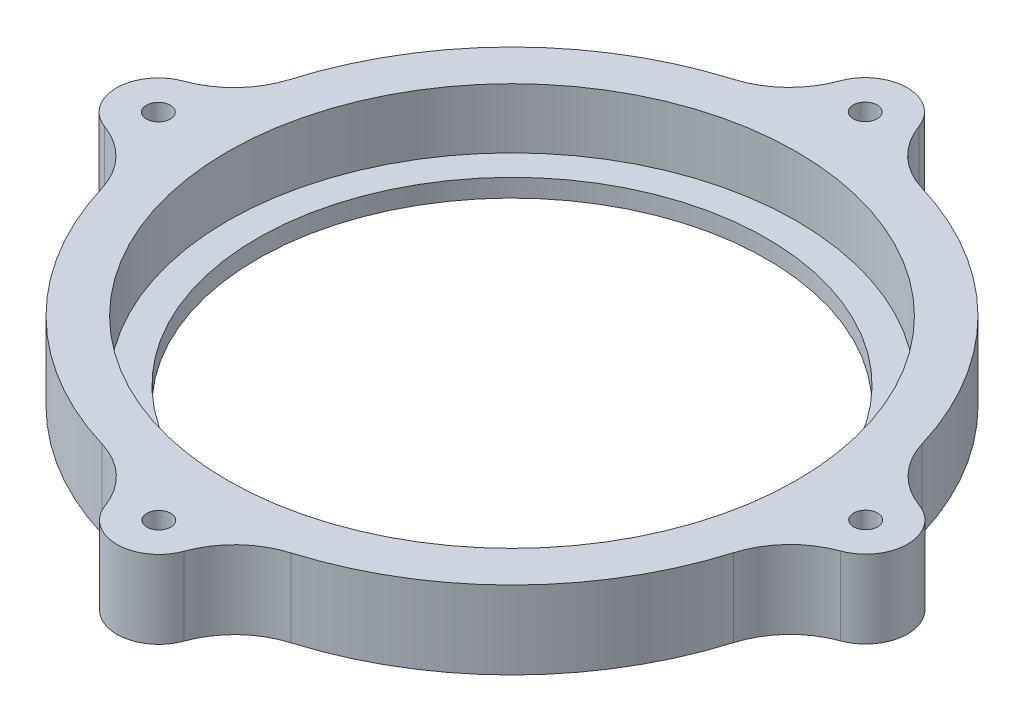
ISO-10303-21;
HEADER;
FILE_DESCRIPTION(('STEP AP214'),'2;1');
FILE_NAME('part.step','',(''),(''),'','','');
FILE_SCHEMA(('AUTOMOTIVE_DESIGN { 1 0 10303 214 1 1 1 1 }'));
ENDSEC;
DATA;
#1=APPLICATION_CONTEXT('core data for automotive mechanical design processes');
#2=APPLICATION_PROTOCOL_DEFINITION('international standard','automotive_design',2000,#1);
#3=PRODUCT_CONTEXT('',#1,'mechanical');
#4=PRODUCT('Part','Part','',(#3));
#5=PRODUCT_RELATED_PRODUCT_CATEGORY('part','',(#4));
#6=PRODUCT_DEFINITION_FORMATION('','',#4);
#7=PRODUCT_DEFINITION_CONTEXT('part definition',#1,'design');
#8=PRODUCT_DEFINITION('design','',#6,#7);
#9=PRODUCT_DEFINITION_SHAPE('','',#8);
#10=(LENGTH_UNIT() NAMED_UNIT(*) SI_UNIT(.MILLI.,.METRE.));
#11=(NAMED_UNIT(*) PLANE_ANGLE_UNIT() SI_UNIT($,.RADIAN.));
#12=(NAMED_UNIT(*) SI_UNIT($,.STERADIAN.) SOLID_ANGLE_UNIT());
#13=UNCERTAINTY_MEASURE_WITH_UNIT(LENGTH_MEASURE(1.E-05),#10,'distance_accuracy_value','');
#14=(GEOMETRIC_REPRESENTATION_CONTEXT(3) GLOBAL_UNCERTAINTY_ASSIGNED_CONTEXT((#13)) GLOBAL_UNIT_ASSIGNED_CONTEXT((#10,
#11,#12)) REPRESENTATION_CONTEXT('',''));
#15=CARTESIAN_POINT('',(0.,0.,0.));
#16=DIRECTION('',(0.,0.,1.));
#17=DIRECTION('',(1.,0.,0.));
#18=AXIS2_PLACEMENT_3D('',#15,#16,#17);
#19=CARTESIAN_POINT('',(58.9885902404785,-13.,-0.0388662219047546));
#20=DIRECTION('',(0.,1.,0.));
#21=DIRECTION('',(0.,0.,1.));
#22=AXIS2_PLACEMENT_3D('',#19,#20,#21);
#23=CYLINDRICAL_SURFACE('',#22,7.00000000000002);
#24=CARTESIAN_POINT('',(58.9885902404785,0.,-0.0388662219047546));
#25=DIRECTION('',(0.,1.,0.));
#26=DIRECTION('',(0.,0.,1.));
#27=AXIS2_PLACEMENT_3D('',#24,#25,#26);
#28=CIRCLE('',#27,7.00000000000002);
#29=CARTESIAN_POINT('',(61.3672422079059,0.,6.54459903720112));
#30=VERTEX_POINT('',#29);
#31=CARTESIAN_POINT('',(61.3585647595326,0.,-6.62546024150506));
#32=VERTEX_POINT('',#31);
#33=EDGE_CURVE('E220',#30,#32,#28,.T.);
#34=ORIENTED_EDGE('',*,*,#33,.F.);
#35=DIRECTION('',(0.,1.,0.));
#36=VECTOR('',#35,1.);
#37=CARTESIAN_POINT('',(61.3672422079059,-13.,6.54459903720112));
#38=LINE('',#37,#36);
#39=CARTESIAN_POINT('',(61.3672422079059,-13.,6.54459903720112));
#40=VERTEX_POINT('',#39);
#41=EDGE_CURVE('E11',#40,#30,#38,.T.);
#42=ORIENTED_EDGE('',*,*,#41,.F.);
#43=CARTESIAN_POINT('',(58.9885902404785,-13.,-0.0388662219047546));
#44=DIRECTION('',(0.,1.,0.));
#45=DIRECTION('',(0.,0.,1.));
#46=AXIS2_PLACEMENT_3D('',#43,#44,#45);
#47=CIRCLE('',#46,7.00000000000002);
#48=CARTESIAN_POINT('',(61.3585647595326,-13.,-6.62546024150506));
#49=VERTEX_POINT('',#48);
#50=EDGE_CURVE('E323',#40,#49,#47,.T.);
#51=ORIENTED_EDGE('',*,*,#50,.T.);
#52=DIRECTION('',(0.,1.,0.));
#53=VECTOR('',#52,1.);
#54=CARTESIAN_POINT('',(61.3585647595326,-13.,-6.62546024150506));
#55=LINE('',#54,#53);
#56=EDGE_CURVE('E129',#49,#32,#55,.T.);
#57=ORIENTED_EDGE('',*,*,#56,.T.);
#58=EDGE_LOOP('',(#34,#42,#51,#57));
#59=FACE_BOUND('',#58,.T.);
#60=ADVANCED_FACE('F47',(#59),#23,.T.);
#61=CARTESIAN_POINT('',(66.1245461427607,-13.,19.7115295554128));
#62=DIRECTION('',(0.,1.,0.));
#63=DIRECTION('',(0.,0.,1.));
#64=AXIS2_PLACEMENT_3D('',#61,#62,#63);
#65=CYLINDRICAL_SURFACE('',#64,14.);
#66=CARTESIAN_POINT('',(66.1245461427607,0.,19.7115295554128));
#67=DIRECTION('',(0.,1.,0.));
#68=DIRECTION('',(0.,0.,1.));
#69=AXIS2_PLACEMENT_3D('',#66,#67,#68);
#70=CIRCLE('',#69,14.);
#71=CARTESIAN_POINT('',(52.7079715630701,0.,15.7120887760537));
#72=VERTEX_POINT('',#71);
#73=EDGE_CURVE('E270',#30,#72,#70,.T.);
#74=ORIENTED_EDGE('',*,*,#73,.T.);
#75=DIRECTION('',(0.,1.,0.));
#76=VECTOR('',#75,1.);
#77=CARTESIAN_POINT('',(52.7079715630701,-13.,15.7120887760537));
#78=LINE('',#77,#76);
#79=CARTESIAN_POINT('',(52.7079715630701,-13.,15.7120887760537));
#80=VERTEX_POINT('',#79);
#81=EDGE_CURVE('E58',#80,#72,#78,.T.);
#82=ORIENTED_EDGE('',*,*,#81,.F.);
#83=CARTESIAN_POINT('',(66.1245461427607,-13.,19.7115295554128));
#84=DIRECTION('',(0.,1.,0.));
#85=DIRECTION('',(0.,0.,1.));
#86=AXIS2_PLACEMENT_3D('',#83,#84,#85);
#87=CIRCLE('',#86,14.);
#88=EDGE_CURVE('E188',#40,#80,#87,.T.);
#89=ORIENTED_EDGE('',*,*,#88,.F.);
#90=ORIENTED_EDGE('',*,*,#41,.T.);
#91=EDGE_LOOP('',(#74,#82,#89,#90));
#92=FACE_BOUND('',#91,.T.);
#93=ADVANCED_FACE('F329',(#92),#65,.F.);
#94=CARTESIAN_POINT('',(0.,-13.,0.));
#95=DIRECTION('',(0.,1.,0.));
#96=DIRECTION('',(0.,0.,1.));
#97=AXIS2_PLACEMENT_3D('',#94,#95,#96);
#98=CYLINDRICAL_SURFACE('',#97,55.);
#99=CARTESIAN_POINT('',(0.,0.,0.));
#100=DIRECTION('',(0.,1.,0.));
#101=DIRECTION('',(0.,0.,1.));
#102=AXIS2_PLACEMENT_3D('',#99,#100,#101);
#103=CIRCLE('',#102,55.);
#104=CARTESIAN_POINT('',(15.7815312382434,0.,52.6872211430471));
#105=VERTEX_POINT('',#104);
#106=EDGE_CURVE('E172',#105,#72,#103,.T.);
#107=ORIENTED_EDGE('',*,*,#106,.F.);
#108=DIRECTION('',(0.,1.,0.));
#109=VECTOR('',#108,1.);
#110=CARTESIAN_POINT('',(15.7815312382434,-13.,52.6872211430471));
#111=LINE('',#110,#109);
#112=CARTESIAN_POINT('',(15.7815312382434,-13.,52.6872211430471));
#113=VERTEX_POINT('',#112);
#114=EDGE_CURVE('E167',#113,#105,#111,.T.);
#115=ORIENTED_EDGE('',*,*,#114,.F.);
#116=CARTESIAN_POINT('',(0.,-13.,0.));
#117=DIRECTION('',(0.,1.,0.));
#118=DIRECTION('',(0.,0.,1.));
#119=AXIS2_PLACEMENT_3D('',#116,#117,#118);
#120=CIRCLE('',#119,55.);
#121=EDGE_CURVE('E170',#113,#80,#120,.T.);
#122=ORIENTED_EDGE('',*,*,#121,.T.);
#123=ORIENTED_EDGE('',*,*,#81,.T.);
#124=EDGE_LOOP('',(#107,#115,#122,#123));
#125=FACE_BOUND('',#124,.T.);
#126=ADVANCED_FACE('F169',(#125),#98,.T.);
#127=CARTESIAN_POINT('',(19.7986482807054,-13.,66.0985137976409));
#128=DIRECTION('',(0.,1.,0.));
#129=DIRECTION('',(0.,0.,1.));
#130=AXIS2_PLACEMENT_3D('',#127,#128,#129);
#131=CYLINDRICAL_SURFACE('',#130,14.);
#132=CARTESIAN_POINT('',(19.7986482807054,0.,66.0985137976409));
#133=DIRECTION('',(0.,1.,0.));
#134=DIRECTION('',(0.,0.,1.));
#135=AXIS2_PLACEMENT_3D('',#132,#133,#134);
#136=CIRCLE('',#135,14.);
#137=CARTESIAN_POINT('',(6.62546024150485,0.,61.3585647595326));
#138=VERTEX_POINT('',#137);
#139=EDGE_CURVE('E267',#138,#105,#136,.F.);
#140=ORIENTED_EDGE('',*,*,#139,.F.);
#141=DIRECTION('',(0.,1.,0.));
#142=VECTOR('',#141,1.);
#143=CARTESIAN_POINT('',(6.62546024150485,-13.,61.3585647595326));
#144=LINE('',#143,#142);
#145=CARTESIAN_POINT('',(6.62546024150485,-13.,61.3585647595326));
#146=VERTEX_POINT('',#145);
#147=EDGE_CURVE('E178',#146,#138,#144,.T.);
#148=ORIENTED_EDGE('',*,*,#147,.F.);
#149=CARTESIAN_POINT('',(19.7986482807054,-13.,66.0985137976409));
#150=DIRECTION('',(0.,1.,0.));
#151=DIRECTION('',(0.,0.,1.));
#152=AXIS2_PLACEMENT_3D('',#149,#150,#151);
#153=CIRCLE('',#152,14.);
#154=EDGE_CURVE('E186',#146,#113,#153,.F.);
#155=ORIENTED_EDGE('',*,*,#154,.T.);
#156=ORIENTED_EDGE('',*,*,#114,.T.);
#157=EDGE_LOOP('',(#140,#148,#155,#156));
#158=FACE_BOUND('',#157,.T.);
#159=ADVANCED_FACE('F193',(#158),#131,.F.);
#160=CARTESIAN_POINT('',(0.0388662219045486,-13.,58.9885902404785));
#161=DIRECTION('',(0.,1.,0.));
#162=DIRECTION('',(0.,0.,1.));
#163=AXIS2_PLACEMENT_3D('',#160,#161,#162);
#164=CYLINDRICAL_SURFACE('',#163,7.00000000000002);
#165=CARTESIAN_POINT('',(0.0388662219045486,0.,58.9885902404785));
#166=DIRECTION('',(0.,1.,0.));
#167=DIRECTION('',(0.,0.,1.));
#168=AXIS2_PLACEMENT_3D('',#165,#166,#167);
#169=CIRCLE('',#168,7.00000000000002);
#170=CARTESIAN_POINT('',(-6.54459903720134,0.,61.3672422079059));
#171=VERTEX_POINT('',#170);
#172=EDGE_CURVE('E263',#171,#138,#169,.T.);
#173=ORIENTED_EDGE('',*,*,#172,.F.);
#174=DIRECTION('',(0.,1.,0.));
#175=VECTOR('',#174,1.);
#176=CARTESIAN_POINT('',(-6.54459903720134,-13.,61.3672422079059));
#177=LINE('',#176,#175);
#178=CARTESIAN_POINT('',(-6.54459903720134,-13.,61.3672422079059));
#179=VERTEX_POINT('',#178);
#180=EDGE_CURVE('E290',#179,#171,#177,.T.);
#181=ORIENTED_EDGE('',*,*,#180,.F.);
#182=CARTESIAN_POINT('',(0.0388662219045486,-13.,58.9885902404785));
#183=DIRECTION('',(0.,1.,0.));
#184=DIRECTION('',(0.,0.,1.));
#185=AXIS2_PLACEMENT_3D('',#182,#183,#184);
#186=CIRCLE('',#185,7.00000000000002);
#187=EDGE_CURVE('E195',#179,#146,#186,.T.);
#188=ORIENTED_EDGE('',*,*,#187,.T.);
#189=ORIENTED_EDGE('',*,*,#147,.T.);
#190=EDGE_LOOP('',(#173,#181,#188,#189));
#191=FACE_BOUND('',#190,.T.);
#192=ADVANCED_FACE('F411',(#191),#164,.T.);
#193=CARTESIAN_POINT('',(-19.7115295554131,-13.,66.1245461427606));
#194=DIRECTION('',(0.,1.,0.));
#195=DIRECTION('',(0.,0.,1.));
#196=AXIS2_PLACEMENT_3D('',#193,#194,#195);
#197=CYLINDRICAL_SURFACE('',#196,14.);
#198=CARTESIAN_POINT('',(-19.7115295554131,0.,66.1245461427606));
#199=DIRECTION('',(0.,1.,0.));
#200=DIRECTION('',(0.,0.,1.));
#201=AXIS2_PLACEMENT_3D('',#198,#199,#200);
#202=CIRCLE('',#201,14.);
#203=CARTESIAN_POINT('',(-15.7120887760539,0.,52.7079715630701));
#204=VERTEX_POINT('',#203);
#205=EDGE_CURVE('E259',#171,#204,#202,.T.);
#206=ORIENTED_EDGE('',*,*,#205,.T.);
#207=DIRECTION('',(0.,1.,0.));
#208=VECTOR('',#207,1.);
#209=CARTESIAN_POINT('',(-15.7120887760539,-13.,52.7079715630701));
#210=LINE('',#209,#208);
#211=CARTESIAN_POINT('',(-15.7120887760539,-13.,52.7079715630701));
#212=VERTEX_POINT('',#211);
#213=EDGE_CURVE('E293',#212,#204,#210,.T.);
#214=ORIENTED_EDGE('',*,*,#213,.F.);
#215=CARTESIAN_POINT('',(-19.7115295554131,-13.,66.1245461427606));
#216=DIRECTION('',(0.,1.,0.));
#217=DIRECTION('',(0.,0.,1.));
#218=AXIS2_PLACEMENT_3D('',#215,#216,#217);
#219=CIRCLE('',#218,14.);
#220=EDGE_CURVE('E198',#179,#212,#219,.T.);
#221=ORIENTED_EDGE('',*,*,#220,.F.);
#222=ORIENTED_EDGE('',*,*,#180,.T.);
#223=EDGE_LOOP('',(#206,#214,#221,#222));
#224=FACE_BOUND('',#223,.T.);
#225=ADVANCED_FACE('F409',(#224),#197,.F.);
#226=CARTESIAN_POINT('',(-52.6872211430471,0.,15.7815312382433));
#227=VERTEX_POINT('',#226);
#228=EDGE_CURVE('E258',#227,#204,#103,.T.);
#229=ORIENTED_EDGE('',*,*,#228,.F.);
#230=DIRECTION('',(0.,1.,0.));
#231=VECTOR('',#230,1.);
#232=CARTESIAN_POINT('',(-52.6872211430471,-13.,15.7815312382433));
#233=LINE('',#232,#231);
#234=CARTESIAN_POINT('',(-52.6872211430471,-13.,15.7815312382433));
#235=VERTEX_POINT('',#234);
#236=EDGE_CURVE('E296',#235,#227,#233,.T.);
#237=ORIENTED_EDGE('',*,*,#236,.F.);
#238=EDGE_CURVE('E191',#235,#212,#120,.T.);
#239=ORIENTED_EDGE('',*,*,#238,.T.);
#240=ORIENTED_EDGE('',*,*,#213,.T.);
#241=EDGE_LOOP('',(#229,#237,#239,#240));
#242=FACE_BOUND('',#241,.T.);
#243=ADVANCED_FACE('F407',(#242),#98,.T.);
#244=CARTESIAN_POINT('',(-66.0985137976409,-13.,19.7986482807052));
#245=DIRECTION('',(0.,1.,0.));
#246=DIRECTION('',(0.,0.,1.));
#247=AXIS2_PLACEMENT_3D('',#244,#245,#246);
#248=CYLINDRICAL_SURFACE('',#247,14.);
#249=CARTESIAN_POINT('',(-66.0985137976409,0.,19.7986482807052));
#250=DIRECTION('',(0.,1.,0.));
#251=DIRECTION('',(0.,0.,1.));
#252=AXIS2_PLACEMENT_3D('',#249,#250,#251);
#253=CIRCLE('',#252,14.);
#254=CARTESIAN_POINT('',(-61.3585647595327,0.,6.62546024150463));
#255=VERTEX_POINT('',#254);
#256=EDGE_CURVE('E254',#255,#227,#253,.F.);
#257=ORIENTED_EDGE('',*,*,#256,.F.);
#258=DIRECTION('',(0.,1.,0.));
#259=VECTOR('',#258,1.);
#260=CARTESIAN_POINT('',(-61.3585647595327,-13.,6.62546024150463));
#261=LINE('',#260,#259);
#262=CARTESIAN_POINT('',(-61.3585647595327,-13.,6.62546024150463));
#263=VERTEX_POINT('',#262);
#264=EDGE_CURVE('E299',#263,#255,#261,.T.);
#265=ORIENTED_EDGE('',*,*,#264,.F.);
#266=CARTESIAN_POINT('',(-66.0985137976409,-13.,19.7986482807052));
#267=DIRECTION('',(0.,1.,0.));
#268=DIRECTION('',(0.,0.,1.));
#269=AXIS2_PLACEMENT_3D('',#266,#267,#268);
#270=CIRCLE('',#269,14.);
#271=EDGE_CURVE('E362',#263,#235,#270,.F.);
#272=ORIENTED_EDGE('',*,*,#271,.T.);
#273=ORIENTED_EDGE('',*,*,#236,.T.);
#274=EDGE_LOOP('',(#257,#265,#272,#273));
#275=FACE_BOUND('',#274,.T.);
#276=ADVANCED_FACE('F442',(#275),#248,.F.);
#277=CARTESIAN_POINT('',(-58.9885902404785,-13.,0.0388662219043427));
#278=DIRECTION('',(0.,1.,0.));
#279=DIRECTION('',(0.,0.,1.));
#280=AXIS2_PLACEMENT_3D('',#277,#278,#279);
#281=CYLINDRICAL_SURFACE('',#280,7.00000000000002);
#282=CARTESIAN_POINT('',(-58.9885902404785,0.,0.0388662219043427));
#283=DIRECTION('',(0.,1.,0.));
#284=DIRECTION('',(0.,0.,1.));
#285=AXIS2_PLACEMENT_3D('',#282,#283,#284);
#286=CIRCLE('',#285,7.00000000000002);
#287=CARTESIAN_POINT('',(-61.3672422079059,0.,-6.54459903720155));
#288=VERTEX_POINT('',#287);
#289=EDGE_CURVE('E250',#288,#255,#286,.T.);
#290=ORIENTED_EDGE('',*,*,#289,.F.);
#291=DIRECTION('',(0.,1.,0.));
#292=VECTOR('',#291,1.);
#293=CARTESIAN_POINT('',(-61.3672422079059,-13.,-6.54459903720155));
#294=LINE('',#293,#292);
#295=CARTESIAN_POINT('',(-61.3672422079059,-13.,-6.54459903720155));
#296=VERTEX_POINT('',#295);
#297=EDGE_CURVE('E302',#296,#288,#294,.T.);
#298=ORIENTED_EDGE('',*,*,#297,.F.);
#299=CARTESIAN_POINT('',(-58.9885902404785,-13.,0.0388662219043427));
#300=DIRECTION('',(0.,1.,0.));
#301=DIRECTION('',(0.,0.,1.));
#302=AXIS2_PLACEMENT_3D('',#299,#300,#301);
#303=CIRCLE('',#302,7.00000000000002);
#304=EDGE_CURVE('E358',#296,#263,#303,.T.);
#305=ORIENTED_EDGE('',*,*,#304,.T.);
#306=ORIENTED_EDGE('',*,*,#264,.T.);
#307=EDGE_LOOP('',(#290,#298,#305,#306));
#308=FACE_BOUND('',#307,.T.);
#309=ADVANCED_FACE('F438',(#308),#281,.T.);
#310=CARTESIAN_POINT('',(-66.1245461427606,-13.,-19.7115295554133));
#311=DIRECTION('',(0.,1.,0.));
#312=DIRECTION('',(0.,0.,1.));
#313=AXIS2_PLACEMENT_3D('',#310,#311,#312);
#314=CYLINDRICAL_SURFACE('',#313,14.);
#315=CARTESIAN_POINT('',(-66.1245461427606,0.,-19.7115295554133));
#316=DIRECTION('',(0.,1.,0.));
#317=DIRECTION('',(0.,0.,1.));
#318=AXIS2_PLACEMENT_3D('',#315,#316,#317);
#319=CIRCLE('',#318,14.);
#320=CARTESIAN_POINT('',(-52.70797156307,0.,-15.7120887760541));
#321=VERTEX_POINT('',#320);
#322=EDGE_CURVE('E246',#288,#321,#319,.T.);
#323=ORIENTED_EDGE('',*,*,#322,.T.);
#324=DIRECTION('',(0.,1.,0.));
#325=VECTOR('',#324,1.);
#326=CARTESIAN_POINT('',(-52.70797156307,-13.,-15.7120887760541));
#327=LINE('',#326,#325);
#328=CARTESIAN_POINT('',(-52.70797156307,-13.,-15.7120887760541));
#329=VERTEX_POINT('',#328);
#330=EDGE_CURVE('E305',#329,#321,#327,.T.);
#331=ORIENTED_EDGE('',*,*,#330,.F.);
#332=CARTESIAN_POINT('',(-66.1245461427606,-13.,-19.7115295554133));
#333=DIRECTION('',(0.,1.,0.));
#334=DIRECTION('',(0.,0.,1.));
#335=AXIS2_PLACEMENT_3D('',#332,#333,#334);
#336=CIRCLE('',#335,14.);
#337=EDGE_CURVE('E355',#296,#329,#336,.T.);
#338=ORIENTED_EDGE('',*,*,#337,.F.);
#339=ORIENTED_EDGE('',*,*,#297,.T.);
#340=EDGE_LOOP('',(#323,#331,#338,#339));
#341=FACE_BOUND('',#340,.T.);
#342=ADVANCED_FACE('F435',(#341),#314,.F.);
#343=CARTESIAN_POINT('',(-15.7815312382431,0.,-52.6872211430472));
#344=VERTEX_POINT('',#343);
#345=EDGE_CURVE('E234',#344,#321,#103,.T.);
#346=ORIENTED_EDGE('',*,*,#345,.F.);
#347=DIRECTION('',(0.,1.,0.));
#348=VECTOR('',#347,1.);
#349=CARTESIAN_POINT('',(-15.7815312382431,-13.,-52.6872211430472));
#350=LINE('',#349,#348);
#351=CARTESIAN_POINT('',(-15.7815312382431,-13.,-52.6872211430472));
#352=VERTEX_POINT('',#351);
#353=EDGE_CURVE('E308',#352,#344,#350,.T.);
#354=ORIENTED_EDGE('',*,*,#353,.F.);
#355=EDGE_CURVE('E344',#352,#329,#120,.T.);
#356=ORIENTED_EDGE('',*,*,#355,.T.);
#357=ORIENTED_EDGE('',*,*,#330,.T.);
#358=EDGE_LOOP('',(#346,#354,#356,#357));
#359=FACE_BOUND('',#358,.T.);
#360=ADVANCED_FACE('F377',(#359),#98,.T.);
#361=CARTESIAN_POINT('',(-19.798648280705,-13.,-66.098513797641));
#362=DIRECTION('',(0.,1.,0.));
#363=DIRECTION('',(0.,0.,1.));
#364=AXIS2_PLACEMENT_3D('',#361,#362,#363);
#365=CYLINDRICAL_SURFACE('',#364,14.);
#366=CARTESIAN_POINT('',(-19.798648280705,0.,-66.098513797641));
#367=DIRECTION('',(0.,1.,0.));
#368=DIRECTION('',(0.,0.,1.));
#369=AXIS2_PLACEMENT_3D('',#366,#367,#368);
#370=CIRCLE('',#369,14.);
#371=CARTESIAN_POINT('',(-6.62546024150442,0.,-61.3585647595327));
#372=VERTEX_POINT('',#371);
#373=EDGE_CURVE('E242',#372,#344,#370,.F.);
#374=ORIENTED_EDGE('',*,*,#373,.F.);
#375=DIRECTION('',(0.,1.,0.));
#376=VECTOR('',#375,1.);
#377=CARTESIAN_POINT('',(-6.62546024150442,-13.,-61.3585647595327));
#378=LINE('',#377,#376);
#379=CARTESIAN_POINT('',(-6.62546024150442,-13.,-61.3585647595327));
#380=VERTEX_POINT('',#379);
#381=EDGE_CURVE('E311',#380,#372,#378,.T.);
#382=ORIENTED_EDGE('',*,*,#381,.F.);
#383=CARTESIAN_POINT('',(-19.798648280705,-13.,-66.098513797641));
#384=DIRECTION('',(0.,1.,0.));
#385=DIRECTION('',(0.,0.,1.));
#386=AXIS2_PLACEMENT_3D('',#383,#384,#385);
#387=CIRCLE('',#386,14.);
#388=EDGE_CURVE('E351',#380,#352,#387,.F.);
#389=ORIENTED_EDGE('',*,*,#388,.T.);
#390=ORIENTED_EDGE('',*,*,#353,.T.);
#391=EDGE_LOOP('',(#374,#382,#389,#390));
#392=FACE_BOUND('',#391,.T.);
#393=ADVANCED_FACE('F385',(#392),#365,.F.);
#394=CARTESIAN_POINT('',(-0.0388662219041367,-13.,-58.9885902404785));
#395=DIRECTION('',(0.,1.,0.));
#396=DIRECTION('',(0.,0.,1.));
#397=AXIS2_PLACEMENT_3D('',#394,#395,#396);
#398=CYLINDRICAL_SURFACE('',#397,7.00000000000002);
#399=CARTESIAN_POINT('',(-0.0388662219041367,0.,-58.9885902404785));
#400=DIRECTION('',(0.,1.,0.));
#401=DIRECTION('',(0.,0.,1.));
#402=AXIS2_PLACEMENT_3D('',#399,#400,#401);
#403=CIRCLE('',#402,7.00000000000002);
#404=CARTESIAN_POINT('',(6.54459903720176,0.,-61.3672422079058));
#405=VERTEX_POINT('',#404);
#406=EDGE_CURVE('E238',#405,#372,#403,.T.);
#407=ORIENTED_EDGE('',*,*,#406,.F.);
#408=DIRECTION('',(0.,1.,0.));
#409=VECTOR('',#408,1.);
#410=CARTESIAN_POINT('',(6.54459903720176,-13.,-61.3672422079058));
#411=LINE('',#410,#409);
#412=CARTESIAN_POINT('',(6.54459903720176,-13.,-61.3672422079058));
#413=VERTEX_POINT('',#412);
#414=EDGE_CURVE('E314',#413,#405,#411,.T.);
#415=ORIENTED_EDGE('',*,*,#414,.F.);
#416=CARTESIAN_POINT('',(-0.0388662219041367,-13.,-58.9885902404785));
#417=DIRECTION('',(0.,1.,0.));
#418=DIRECTION('',(0.,0.,1.));
#419=AXIS2_PLACEMENT_3D('',#416,#417,#418);
#420=CIRCLE('',#419,7.00000000000002);
#421=EDGE_CURVE('E347',#413,#380,#420,.T.);
#422=ORIENTED_EDGE('',*,*,#421,.T.);
#423=ORIENTED_EDGE('',*,*,#381,.T.);
#424=EDGE_LOOP('',(#407,#415,#422,#423));
#425=FACE_BOUND('',#424,.T.);
#426=ADVANCED_FACE('F388',(#425),#398,.T.);
#427=CARTESIAN_POINT('',(19.7115295554135,-13.,-66.1245461427605));
#428=DIRECTION('',(0.,1.,0.));
#429=DIRECTION('',(0.,0.,1.));
#430=AXIS2_PLACEMENT_3D('',#427,#428,#429);
#431=CYLINDRICAL_SURFACE('',#430,14.);
#432=CARTESIAN_POINT('',(19.7115295554135,0.,-66.1245461427605));
#433=DIRECTION('',(0.,1.,0.));
#434=DIRECTION('',(0.,0.,1.));
#435=AXIS2_PLACEMENT_3D('',#432,#433,#434);
#436=CIRCLE('',#435,14.);
#437=CARTESIAN_POINT('',(15.7120887760543,0.,-52.7079715630699));
#438=VERTEX_POINT('',#437);
#439=EDGE_CURVE('E233',#405,#438,#436,.T.);
#440=ORIENTED_EDGE('',*,*,#439,.T.);
#441=DIRECTION('',(0.,1.,0.));
#442=VECTOR('',#441,1.);
#443=CARTESIAN_POINT('',(15.7120887760543,-13.,-52.7079715630699));
#444=LINE('',#443,#442);
#445=CARTESIAN_POINT('',(15.7120887760543,-13.,-52.7079715630699));
#446=VERTEX_POINT('',#445);
#447=EDGE_CURVE('E317',#446,#438,#444,.T.);
#448=ORIENTED_EDGE('',*,*,#447,.F.);
#449=CARTESIAN_POINT('',(19.7115295554135,-13.,-66.1245461427605));
#450=DIRECTION('',(0.,1.,0.));
#451=DIRECTION('',(0.,0.,1.));
#452=AXIS2_PLACEMENT_3D('',#449,#450,#451);
#453=CIRCLE('',#452,14.);
#454=EDGE_CURVE('E343',#413,#446,#453,.T.);
#455=ORIENTED_EDGE('',*,*,#454,.F.);
#456=ORIENTED_EDGE('',*,*,#414,.T.);
#457=EDGE_LOOP('',(#440,#448,#455,#456));
#458=FACE_BOUND('',#457,.T.);
#459=ADVANCED_FACE('F392',(#458),#431,.F.);
#460=CARTESIAN_POINT('',(52.687221143047,0.,-15.7815312382436));
#461=VERTEX_POINT('',#460);
#462=EDGE_CURVE('E229',#461,#438,#103,.T.);
#463=ORIENTED_EDGE('',*,*,#462,.F.);
#464=DIRECTION('',(0.,1.,0.));
#465=VECTOR('',#464,1.);
#466=CARTESIAN_POINT('',(52.687221143047,-13.,-15.7815312382436));
#467=LINE('',#466,#465);
#468=CARTESIAN_POINT('',(52.687221143047,-13.,-15.7815312382436));
#469=VERTEX_POINT('',#468);
#470=EDGE_CURVE('E320',#469,#461,#467,.T.);
#471=ORIENTED_EDGE('',*,*,#470,.F.);
#472=EDGE_CURVE('E192',#469,#446,#120,.T.);
#473=ORIENTED_EDGE('',*,*,#472,.T.);
#474=ORIENTED_EDGE('',*,*,#447,.T.);
#475=EDGE_LOOP('',(#463,#471,#473,#474));
#476=FACE_BOUND('',#475,.T.);
#477=ADVANCED_FACE('F395',(#476),#98,.T.);
#478=CARTESIAN_POINT('',(-58.9885902404785,-13.,0.0388662219043427));
#479=DIRECTION('',(0.,1.,0.));
#480=DIRECTION('',(0.,0.,1.));
#481=AXIS2_PLACEMENT_3D('',#478,#479,#480);
#482=CYLINDRICAL_SURFACE('',#481,2.00000000000001);
#483=CARTESIAN_POINT('',(-58.9885902404785,-13.,0.0388662219043427));
#484=DIRECTION('',(0.,1.,0.));
#485=DIRECTION('',(0.,0.,1.));
#486=AXIS2_PLACEMENT_3D('',#483,#484,#485);
#487=CIRCLE('',#486,2.00000000000001);
#488=CARTESIAN_POINT('',(-58.9885902404785,-13.,2.03886622190435));
#489=VERTEX_POINT('',#488);
#490=EDGE_CURVE('E208',#489,#489,#487,.T.);
#491=ORIENTED_EDGE('',*,*,#490,.F.);
#492=EDGE_LOOP('',(#491));
#493=FACE_BOUND('',#492,.T.);
#494=CARTESIAN_POINT('',(-58.9885902404785,0.,0.0388662219043427));
#495=DIRECTION('',(0.,1.,0.));
#496=DIRECTION('',(0.,0.,1.));
#497=AXIS2_PLACEMENT_3D('',#494,#495,#496);
#498=CIRCLE('',#497,2.00000000000001);
#499=CARTESIAN_POINT('',(-58.9885902404785,0.,2.03886622190435));
#500=VERTEX_POINT('',#499);
#501=EDGE_CURVE('E277',#500,#500,#498,.T.);
#502=ORIENTED_EDGE('',*,*,#501,.T.);
#503=EDGE_LOOP('',(#502));
#504=FACE_BOUND('',#503,.T.);
#505=ADVANCED_FACE('F458',(#493,#504),#482,.F.);
#506=CARTESIAN_POINT('',(0.0388662219045486,-13.,58.9885902404785));
#507=DIRECTION('',(0.,1.,0.));
#508=DIRECTION('',(0.,0.,1.));
#509=AXIS2_PLACEMENT_3D('',#506,#507,#508);
#510=CYLINDRICAL_SURFACE('',#509,2.);
#511=CARTESIAN_POINT('',(0.0388662219045486,-13.,58.9885902404785));
#512=DIRECTION('',(0.,1.,0.));
#513=DIRECTION('',(0.,0.,1.));
#514=AXIS2_PLACEMENT_3D('',#511,#512,#513);
#515=CIRCLE('',#514,2.);
#516=CARTESIAN_POINT('',(0.0388662219045486,-13.,60.9885902404785));
#517=VERTEX_POINT('',#516);
#518=EDGE_CURVE('E204',#517,#517,#515,.T.);
#519=ORIENTED_EDGE('',*,*,#518,.F.);
#520=EDGE_LOOP('',(#519));
#521=FACE_BOUND('',#520,.T.);
#522=CARTESIAN_POINT('',(0.0388662219045486,0.,58.9885902404785));
#523=DIRECTION('',(0.,1.,0.));
#524=DIRECTION('',(0.,0.,1.));
#525=AXIS2_PLACEMENT_3D('',#522,#523,#524);
#526=CIRCLE('',#525,2.);
#527=CARTESIAN_POINT('',(0.0388662219045486,0.,60.9885902404785));
#528=VERTEX_POINT('',#527);
#529=EDGE_CURVE('E273',#528,#528,#526,.T.);
#530=ORIENTED_EDGE('',*,*,#529,.T.);
#531=EDGE_LOOP('',(#530));
#532=FACE_BOUND('',#531,.T.);
#533=ADVANCED_FACE('F428',(#521,#532),#510,.F.);
#534=CARTESIAN_POINT('',(66.0985137976408,-13.,-19.7986482807056));
#535=DIRECTION('',(0.,1.,0.));
#536=DIRECTION('',(0.,0.,1.));
#537=AXIS2_PLACEMENT_3D('',#534,#535,#536);
#538=CYLINDRICAL_SURFACE('',#537,14.);
#539=CARTESIAN_POINT('',(66.0985137976408,0.,-19.7986482807056));
#540=DIRECTION('',(0.,1.,0.));
#541=DIRECTION('',(0.,0.,1.));
#542=AXIS2_PLACEMENT_3D('',#539,#540,#541);
#543=CIRCLE('',#542,14.);
#544=EDGE_CURVE('E225',#32,#461,#543,.F.);
#545=ORIENTED_EDGE('',*,*,#544,.F.);
#546=ORIENTED_EDGE('',*,*,#56,.F.);
#547=CARTESIAN_POINT('',(66.0985137976408,-13.,-19.7986482807056));
#548=DIRECTION('',(0.,1.,0.));
#549=DIRECTION('',(0.,0.,1.));
#550=AXIS2_PLACEMENT_3D('',#547,#548,#549);
#551=CIRCLE('',#550,14.);
#552=EDGE_CURVE('E331',#49,#469,#551,.F.);
#553=ORIENTED_EDGE('',*,*,#552,.T.);
#554=ORIENTED_EDGE('',*,*,#470,.T.);
#555=EDGE_LOOP('',(#545,#546,#553,#554));
#556=FACE_BOUND('',#555,.T.);
#557=ADVANCED_FACE('F324',(#556),#538,.F.);
#558=CARTESIAN_POINT('',(58.9885902404785,-13.,-0.0388662219047546));
#559=DIRECTION('',(0.,1.,0.));
#560=DIRECTION('',(0.,0.,1.));
#561=AXIS2_PLACEMENT_3D('',#558,#559,#560);
#562=CYLINDRICAL_SURFACE('',#561,2.);
#563=CARTESIAN_POINT('',(58.9885902404785,-13.,-0.0388662219047546));
#564=DIRECTION('',(0.,1.,0.));
#565=DIRECTION('',(0.,0.,1.));
#566=AXIS2_PLACEMENT_3D('',#563,#564,#565);
#567=CIRCLE('',#566,2.);
#568=CARTESIAN_POINT('',(58.9885902404785,-13.,1.96113377809525));
#569=VERTEX_POINT('',#568);
#570=EDGE_CURVE('E284',#569,#569,#567,.T.);
#571=ORIENTED_EDGE('',*,*,#570,.F.);
#572=EDGE_LOOP('',(#571));
#573=FACE_BOUND('',#572,.T.);
#574=CARTESIAN_POINT('',(58.9885902404785,0.,-0.0388662219047546));
#575=DIRECTION('',(0.,1.,0.));
#576=DIRECTION('',(0.,0.,1.));
#577=AXIS2_PLACEMENT_3D('',#574,#575,#576);
#578=CIRCLE('',#577,2.);
#579=CARTESIAN_POINT('',(58.9885902404785,0.,1.96113377809525));
#580=VERTEX_POINT('',#579);
#581=EDGE_CURVE('E216',#580,#580,#578,.T.);
#582=ORIENTED_EDGE('',*,*,#581,.T.);
#583=EDGE_LOOP('',(#582));
#584=FACE_BOUND('',#583,.T.);
#585=ADVANCED_FACE('F49',(#573,#584),#562,.F.);
#586=CARTESIAN_POINT('',(-0.0388662219041367,-13.,-58.9885902404785));
#587=DIRECTION('',(0.,1.,0.));
#588=DIRECTION('',(0.,0.,1.));
#589=AXIS2_PLACEMENT_3D('',#586,#587,#588);
#590=CYLINDRICAL_SURFACE('',#589,2.);
#591=CARTESIAN_POINT('',(-0.0388662219041367,-13.,-58.9885902404785));
#592=DIRECTION('',(0.,1.,0.));
#593=DIRECTION('',(0.,0.,1.));
#594=AXIS2_PLACEMENT_3D('',#591,#592,#593);
#595=CIRCLE('',#594,2.);
#596=CARTESIAN_POINT('',(-0.0388662219041367,-13.,-56.9885902404785));
#597=VERTEX_POINT('',#596);
#598=EDGE_CURVE('E212',#597,#597,#595,.T.);
#599=ORIENTED_EDGE('',*,*,#598,.F.);
#600=EDGE_LOOP('',(#599));
#601=FACE_BOUND('',#600,.T.);
#602=CARTESIAN_POINT('',(-0.0388662219041367,0.,-58.9885902404785));
#603=DIRECTION('',(0.,1.,0.));
#604=DIRECTION('',(0.,0.,1.));
#605=AXIS2_PLACEMENT_3D('',#602,#603,#604);
#606=CIRCLE('',#605,2.);
#607=CARTESIAN_POINT('',(-0.0388662219041367,0.,-56.9885902404785));
#608=VERTEX_POINT('',#607);
#609=EDGE_CURVE('E281',#608,#608,#606,.T.);
#610=ORIENTED_EDGE('',*,*,#609,.T.);
#611=EDGE_LOOP('',(#610));
#612=FACE_BOUND('',#611,.T.);
#613=ADVANCED_FACE('F472',(#601,#612),#590,.F.);
#614=CARTESIAN_POINT('',(0.,-13.,0.));
#615=DIRECTION('',(0.,1.,0.));
#616=DIRECTION('',(0.,0.,1.));
#617=AXIS2_PLACEMENT_3D('',#614,#615,#616);
#618=PLANE('',#617);
#619=CARTESIAN_POINT('',(0.,-13.,0.));
#620=DIRECTION('',(0.,1.,0.));
#621=DIRECTION('',(0.,0.,1.));
#622=AXIS2_PLACEMENT_3D('',#619,#620,#621);
#623=CIRCLE('',#622,42.5);
#624=CARTESIAN_POINT('',(0.,-13.,42.5));
#625=VERTEX_POINT('',#624);
#626=EDGE_CURVE('E51',#625,#625,#623,.T.);
#627=ORIENTED_EDGE('',*,*,#626,.T.);
#628=EDGE_LOOP('',(#627));
#629=FACE_BOUND('',#628,.T.);
#630=ORIENTED_EDGE('',*,*,#570,.T.);
#631=EDGE_LOOP('',(#630));
#632=FACE_BOUND('',#631,.T.);
#633=ORIENTED_EDGE('',*,*,#50,.F.);
#634=ORIENTED_EDGE('',*,*,#88,.T.);
#635=ORIENTED_EDGE('',*,*,#121,.F.);
#636=ORIENTED_EDGE('',*,*,#154,.F.);
#637=ORIENTED_EDGE('',*,*,#187,.F.);
#638=ORIENTED_EDGE('',*,*,#220,.T.);
#639=ORIENTED_EDGE('',*,*,#238,.F.);
#640=ORIENTED_EDGE('',*,*,#271,.F.);
#641=ORIENTED_EDGE('',*,*,#304,.F.);
#642=ORIENTED_EDGE('',*,*,#337,.T.);
#643=ORIENTED_EDGE('',*,*,#355,.F.);
#644=ORIENTED_EDGE('',*,*,#388,.F.);
#645=ORIENTED_EDGE('',*,*,#421,.F.);
#646=ORIENTED_EDGE('',*,*,#454,.T.);
#647=ORIENTED_EDGE('',*,*,#472,.F.);
#648=ORIENTED_EDGE('',*,*,#552,.F.);
#649=EDGE_LOOP('',(#633,#634,#635,#636,#637,#638,#639,#640,#641,#642,#643,#644,#645,#646,#647,#648));
#650=FACE_BOUND('',#649,.T.);
#651=ORIENTED_EDGE('',*,*,#518,.T.);
#652=EDGE_LOOP('',(#651));
#653=FACE_BOUND('',#652,.T.);
#654=ORIENTED_EDGE('',*,*,#490,.T.);
#655=EDGE_LOOP('',(#654));
#656=FACE_BOUND('',#655,.T.);
#657=ORIENTED_EDGE('',*,*,#598,.T.);
#658=EDGE_LOOP('',(#657));
#659=FACE_BOUND('',#658,.T.);
#660=ADVANCED_FACE('F183',(#629,#632,#650,#653,#656,#659),#618,.F.);
#661=CARTESIAN_POINT('',(0.,0.,0.));
#662=DIRECTION('',(0.,1.,0.));
#663=DIRECTION('',(0.,0.,1.));
#664=AXIS2_PLACEMENT_3D('',#661,#662,#663);
#665=PLANE('',#664);
#666=CARTESIAN_POINT('',(0.,0.,0.));
#667=DIRECTION('',(0.,1.,0.));
#668=DIRECTION('',(0.,0.,1.));
#669=AXIS2_PLACEMENT_3D('',#666,#667,#668);
#670=CIRCLE('',#669,47.5);
#671=CARTESIAN_POINT('',(0.,0.,47.5));
#672=VERTEX_POINT('',#671);
#673=EDGE_CURVE('E502',#672,#672,#670,.T.);
#674=ORIENTED_EDGE('',*,*,#673,.F.);
#675=EDGE_LOOP('',(#674));
#676=FACE_BOUND('',#675,.T.);
#677=ORIENTED_EDGE('',*,*,#581,.F.);
#678=EDGE_LOOP('',(#677));
#679=FACE_BOUND('',#678,.T.);
#680=ORIENTED_EDGE('',*,*,#33,.T.);
#681=ORIENTED_EDGE('',*,*,#544,.T.);
#682=ORIENTED_EDGE('',*,*,#462,.T.);
#683=ORIENTED_EDGE('',*,*,#439,.F.);
#684=ORIENTED_EDGE('',*,*,#406,.T.);
#685=ORIENTED_EDGE('',*,*,#373,.T.);
#686=ORIENTED_EDGE('',*,*,#345,.T.);
#687=ORIENTED_EDGE('',*,*,#322,.F.);
#688=ORIENTED_EDGE('',*,*,#289,.T.);
#689=ORIENTED_EDGE('',*,*,#256,.T.);
#690=ORIENTED_EDGE('',*,*,#228,.T.);
#691=ORIENTED_EDGE('',*,*,#205,.F.);
#692=ORIENTED_EDGE('',*,*,#172,.T.);
#693=ORIENTED_EDGE('',*,*,#139,.T.);
#694=ORIENTED_EDGE('',*,*,#106,.T.);
#695=ORIENTED_EDGE('',*,*,#73,.F.);
#696=EDGE_LOOP('',(#680,#681,#682,#683,#684,#685,#686,#687,#688,#689,#690,#691,#692,#693,#694,#695));
#697=FACE_BOUND('',#696,.T.);
#698=ORIENTED_EDGE('',*,*,#529,.F.);
#699=EDGE_LOOP('',(#698));
#700=FACE_BOUND('',#699,.T.);
#701=ORIENTED_EDGE('',*,*,#501,.F.);
#702=EDGE_LOOP('',(#701));
#703=FACE_BOUND('',#702,.T.);
#704=ORIENTED_EDGE('',*,*,#609,.F.);
#705=EDGE_LOOP('',(#704));
#706=FACE_BOUND('',#705,.T.);
#707=ADVANCED_FACE('F327',(#676,#679,#697,#700,#703,#706),#665,.T.);
#708=CARTESIAN_POINT('',(0.,-9.99999999999999,0.));
#709=DIRECTION('',(0.,1.,0.));
#710=DIRECTION('',(0.,0.,1.));
#711=AXIS2_PLACEMENT_3D('',#708,#709,#710);
#712=CYLINDRICAL_SURFACE('',#711,47.5);
#713=CARTESIAN_POINT('',(0.,-9.99999999999999,0.));
#714=DIRECTION('',(0.,1.,0.));
#715=DIRECTION('',(0.,0.,1.));
#716=AXIS2_PLACEMENT_3D('',#713,#714,#715);
#717=CIRCLE('',#716,47.5);
#718=CARTESIAN_POINT('',(0.,-9.99999999999999,47.5));
#719=VERTEX_POINT('',#718);
#720=EDGE_CURVE('E221',#719,#719,#717,.T.);
#721=ORIENTED_EDGE('',*,*,#720,.F.);
#722=EDGE_LOOP('',(#721));
#723=FACE_BOUND('',#722,.T.);
#724=ORIENTED_EDGE('',*,*,#673,.T.);
#725=EDGE_LOOP('',(#724));
#726=FACE_BOUND('',#725,.T.);
#727=ADVANCED_FACE('F478',(#723,#726),#712,.F.);
#728=CARTESIAN_POINT('',(0.,-9.99999999999999,0.));
#729=DIRECTION('',(0.,1.,0.));
#730=DIRECTION('',(0.,0.,1.));
#731=AXIS2_PLACEMENT_3D('',#728,#729,#730);
#732=PLANE('',#731);
#733=CARTESIAN_POINT('',(0.,-9.99999999999999,0.));
#734=DIRECTION('',(0.,1.,0.));
#735=DIRECTION('',(0.,0.,1.));
#736=AXIS2_PLACEMENT_3D('',#733,#734,#735);
#737=CIRCLE('',#736,42.5);
#738=CARTESIAN_POINT('',(0.,-9.99999999999999,42.5));
#739=VERTEX_POINT('',#738);
#740=EDGE_CURVE('E498',#739,#739,#737,.T.);
#741=ORIENTED_EDGE('',*,*,#740,.F.);
#742=EDGE_LOOP('',(#741));
#743=FACE_BOUND('',#742,.T.);
#744=ORIENTED_EDGE('',*,*,#720,.T.);
#745=EDGE_LOOP('',(#744));
#746=FACE_BOUND('',#745,.T.);
#747=ADVANCED_FACE('F485',(#743,#746),#732,.T.);
#748=CARTESIAN_POINT('',(0.,-20.,0.));
#749=DIRECTION('',(0.,1.,0.));
#750=DIRECTION('',(0.,0.,1.));
#751=AXIS2_PLACEMENT_3D('',#748,#749,#750);
#752=CYLINDRICAL_SURFACE('',#751,42.5);
#753=ORIENTED_EDGE('',*,*,#740,.T.);
#754=EDGE_LOOP('',(#753));
#755=FACE_BOUND('',#754,.T.);
#756=ORIENTED_EDGE('',*,*,#626,.F.);
#757=EDGE_LOOP('',(#756));
#758=FACE_BOUND('',#757,.T.);
#759=ADVANCED_FACE('F489',(#755,#758),#752,.F.);
#760=CLOSED_SHELL('',(#60,#93,#126,#159,#192,#225,#243,#276,#309,#342,#360,#393,#426,#459,#477,
#505,#533,#557,#585,#613,#660,#707,#727,#747,#759));
#761=MANIFOLD_SOLID_BREP('B2',#760);
#762=ADVANCED_BREP_SHAPE_REPRESENTATION('',(#18,#761),#14);
#763=SHAPE_DEFINITION_REPRESENTATION(#9,#762);
ENDSEC;
END-ISO-10303-21;
